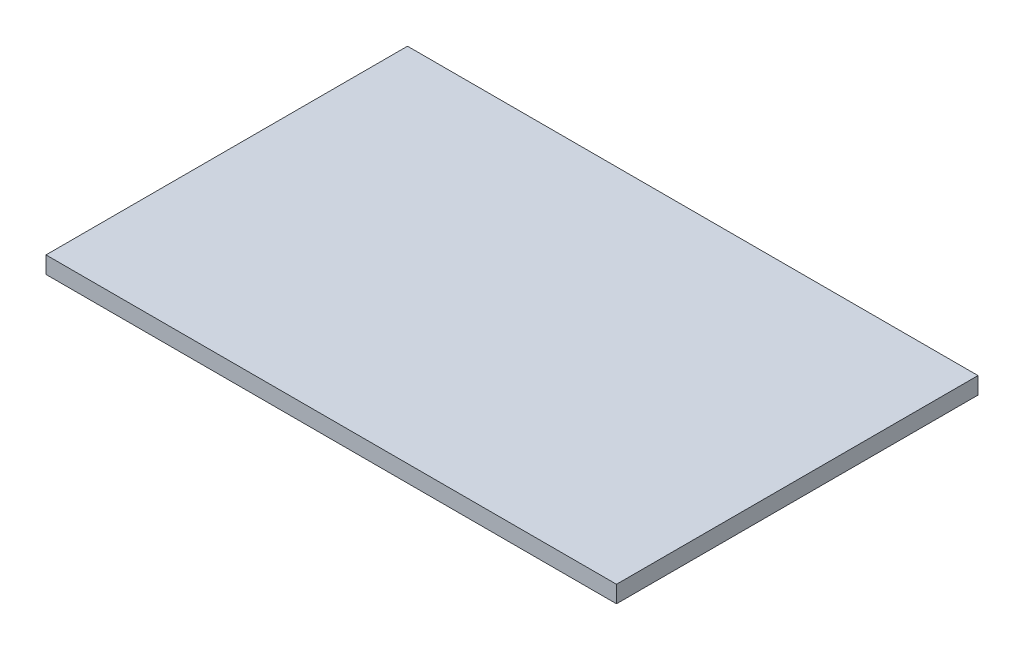
ISO-10303-21;
HEADER;
FILE_DESCRIPTION(('STEP AP214'),'2;1');
FILE_NAME('part.step','',(''),(''),'','','');
FILE_SCHEMA(('AUTOMOTIVE_DESIGN { 1 0 10303 214 1 1 1 1 }'));
ENDSEC;
DATA;
#1=APPLICATION_CONTEXT('core data for automotive mechanical design processes');
#2=APPLICATION_PROTOCOL_DEFINITION('international standard','automotive_design',2000,#1);
#3=PRODUCT_CONTEXT('',#1,'mechanical');
#4=PRODUCT('Part','Part','',(#3));
#5=PRODUCT_RELATED_PRODUCT_CATEGORY('part','',(#4));
#6=PRODUCT_DEFINITION_FORMATION('','',#4);
#7=PRODUCT_DEFINITION_CONTEXT('part definition',#1,'design');
#8=PRODUCT_DEFINITION('design','',#6,#7);
#9=PRODUCT_DEFINITION_SHAPE('','',#8);
#10=(LENGTH_UNIT() NAMED_UNIT(*) SI_UNIT(.MILLI.,.METRE.));
#11=(NAMED_UNIT(*) PLANE_ANGLE_UNIT() SI_UNIT($,.RADIAN.));
#12=(NAMED_UNIT(*) SI_UNIT($,.STERADIAN.) SOLID_ANGLE_UNIT());
#13=UNCERTAINTY_MEASURE_WITH_UNIT(LENGTH_MEASURE(1.E-05),#10,'distance_accuracy_value','');
#14=(GEOMETRIC_REPRESENTATION_CONTEXT(3) GLOBAL_UNCERTAINTY_ASSIGNED_CONTEXT((#13)) GLOBAL_UNIT_ASSIGNED_CONTEXT((#10,
#11,#12)) REPRESENTATION_CONTEXT('',''));
#15=CARTESIAN_POINT('',(0.,0.,0.));
#16=DIRECTION('',(0.,0.,1.));
#17=DIRECTION('',(1.,0.,0.));
#18=AXIS2_PLACEMENT_3D('',#15,#16,#17);
#19=CARTESIAN_POINT('',(50.5,3.,32.));
#20=DIRECTION('',(-1.,0.,0.));
#21=DIRECTION('',(0.,0.,1.));
#22=AXIS2_PLACEMENT_3D('',#19,#20,#21);
#23=PLANE('',#22);
#24=DIRECTION('',(0.,0.,-1.));
#25=VECTOR('',#24,1.);
#26=CARTESIAN_POINT('',(50.5,0.,32.));
#27=LINE('',#26,#25);
#28=CARTESIAN_POINT('',(50.5,0.,32.));
#29=VERTEX_POINT('',#28);
#30=CARTESIAN_POINT('',(50.5,0.,-32.));
#31=VERTEX_POINT('',#30);
#32=EDGE_CURVE('E96',#29,#31,#27,.T.);
#33=ORIENTED_EDGE('',*,*,#32,.T.);
#34=DIRECTION('',(0.,-1.,0.));
#35=VECTOR('',#34,1.);
#36=CARTESIAN_POINT('',(50.5,3.,-32.));
#37=LINE('',#36,#35);
#38=CARTESIAN_POINT('',(50.5,3.,-32.));
#39=VERTEX_POINT('',#38);
#40=EDGE_CURVE('E11',#39,#31,#37,.T.);
#41=ORIENTED_EDGE('',*,*,#40,.F.);
#42=DIRECTION('',(0.,0.,-1.));
#43=VECTOR('',#42,1.);
#44=CARTESIAN_POINT('',(50.5,3.,32.));
#45=LINE('',#44,#43);
#46=CARTESIAN_POINT('',(50.5,3.,32.));
#47=VERTEX_POINT('',#46);
#48=EDGE_CURVE('E84',#47,#39,#45,.T.);
#49=ORIENTED_EDGE('',*,*,#48,.F.);
#50=DIRECTION('',(0.,-1.,0.));
#51=VECTOR('',#50,1.);
#52=CARTESIAN_POINT('',(50.5,3.,32.));
#53=LINE('',#52,#51);
#54=EDGE_CURVE('E92',#47,#29,#53,.T.);
#55=ORIENTED_EDGE('',*,*,#54,.T.);
#56=EDGE_LOOP('',(#33,#41,#49,#55));
#57=FACE_BOUND('',#56,.T.);
#58=ADVANCED_FACE('F33',(#57),#23,.F.);
#59=CARTESIAN_POINT('',(-50.5,3.,-32.));
#60=DIRECTION('',(0.,0.,1.));
#61=DIRECTION('',(1.,0.,0.));
#62=AXIS2_PLACEMENT_3D('',#59,#60,#61);
#63=PLANE('',#62);
#64=DIRECTION('',(-1.,0.,0.));
#65=VECTOR('',#64,1.);
#66=CARTESIAN_POINT('',(-50.5,0.,-32.));
#67=LINE('',#66,#65);
#68=CARTESIAN_POINT('',(-50.5,0.,-32.));
#69=VERTEX_POINT('',#68);
#70=EDGE_CURVE('E88',#31,#69,#67,.T.);
#71=ORIENTED_EDGE('',*,*,#70,.T.);
#72=DIRECTION('',(0.,-1.,0.));
#73=VECTOR('',#72,1.);
#74=CARTESIAN_POINT('',(-50.5,3.,-32.));
#75=LINE('',#74,#73);
#76=CARTESIAN_POINT('',(-50.5,3.,-32.));
#77=VERTEX_POINT('',#76);
#78=EDGE_CURVE('E41',#77,#69,#75,.T.);
#79=ORIENTED_EDGE('',*,*,#78,.F.);
#80=DIRECTION('',(-1.,0.,0.));
#81=VECTOR('',#80,1.);
#82=CARTESIAN_POINT('',(-50.5,3.,-32.));
#83=LINE('',#82,#81);
#84=EDGE_CURVE('E79',#39,#77,#83,.T.);
#85=ORIENTED_EDGE('',*,*,#84,.F.);
#86=ORIENTED_EDGE('',*,*,#40,.T.);
#87=EDGE_LOOP('',(#71,#79,#85,#86));
#88=FACE_BOUND('',#87,.T.);
#89=ADVANCED_FACE('F87',(#88),#63,.F.);
#90=CARTESIAN_POINT('',(-50.5,3.,32.));
#91=DIRECTION('',(1.,0.,0.));
#92=DIRECTION('',(0.,0.,-1.));
#93=AXIS2_PLACEMENT_3D('',#90,#91,#92);
#94=PLANE('',#93);
#95=DIRECTION('',(0.,0.,1.));
#96=VECTOR('',#95,1.);
#97=CARTESIAN_POINT('',(-50.5,0.,32.));
#98=LINE('',#97,#96);
#99=CARTESIAN_POINT('',(-50.5,0.,32.));
#100=VERTEX_POINT('',#99);
#101=EDGE_CURVE('E66',#69,#100,#98,.T.);
#102=ORIENTED_EDGE('',*,*,#101,.T.);
#103=DIRECTION('',(0.,-1.,0.));
#104=VECTOR('',#103,1.);
#105=CARTESIAN_POINT('',(-50.5,3.,32.));
#106=LINE('',#105,#104);
#107=CARTESIAN_POINT('',(-50.5,3.,32.));
#108=VERTEX_POINT('',#107);
#109=EDGE_CURVE('E89',#108,#100,#106,.T.);
#110=ORIENTED_EDGE('',*,*,#109,.F.);
#111=DIRECTION('',(0.,0.,1.));
#112=VECTOR('',#111,1.);
#113=CARTESIAN_POINT('',(-50.5,3.,32.));
#114=LINE('',#113,#112);
#115=EDGE_CURVE('E82',#77,#108,#114,.T.);
#116=ORIENTED_EDGE('',*,*,#115,.F.);
#117=ORIENTED_EDGE('',*,*,#78,.T.);
#118=EDGE_LOOP('',(#102,#110,#116,#117));
#119=FACE_BOUND('',#118,.T.);
#120=ADVANCED_FACE('F90',(#119),#94,.F.);
#121=CARTESIAN_POINT('',(-50.5,3.,32.));
#122=DIRECTION('',(0.,0.,-1.));
#123=DIRECTION('',(-1.,0.,0.));
#124=AXIS2_PLACEMENT_3D('',#121,#122,#123);
#125=PLANE('',#124);
#126=DIRECTION('',(1.,0.,0.));
#127=VECTOR('',#126,1.);
#128=CARTESIAN_POINT('',(-50.5,0.,32.));
#129=LINE('',#128,#127);
#130=EDGE_CURVE('E72',#100,#29,#129,.T.);
#131=ORIENTED_EDGE('',*,*,#130,.T.);
#132=ORIENTED_EDGE('',*,*,#54,.F.);
#133=DIRECTION('',(1.,0.,0.));
#134=VECTOR('',#133,1.);
#135=CARTESIAN_POINT('',(-50.5,3.,32.));
#136=LINE('',#135,#134);
#137=EDGE_CURVE('E49',#108,#47,#136,.T.);
#138=ORIENTED_EDGE('',*,*,#137,.F.);
#139=ORIENTED_EDGE('',*,*,#109,.T.);
#140=EDGE_LOOP('',(#131,#132,#138,#139));
#141=FACE_BOUND('',#140,.T.);
#142=ADVANCED_FACE('F103',(#141),#125,.F.);
#143=CARTESIAN_POINT('',(0.,3.,0.));
#144=DIRECTION('',(0.,-1.,0.));
#145=DIRECTION('',(0.,0.,-1.));
#146=AXIS2_PLACEMENT_3D('',#143,#144,#145);
#147=PLANE('',#146);
#148=ORIENTED_EDGE('',*,*,#48,.T.);
#149=ORIENTED_EDGE('',*,*,#84,.T.);
#150=ORIENTED_EDGE('',*,*,#115,.T.);
#151=ORIENTED_EDGE('',*,*,#137,.T.);
#152=EDGE_LOOP('',(#148,#149,#150,#151));
#153=FACE_BOUND('',#152,.T.);
#154=ADVANCED_FACE('F80',(#153),#147,.F.);
#155=CARTESIAN_POINT('',(0.,0.,0.));
#156=DIRECTION('',(0.,-1.,0.));
#157=DIRECTION('',(0.,0.,-1.));
#158=AXIS2_PLACEMENT_3D('',#155,#156,#157);
#159=PLANE('',#158);
#160=ORIENTED_EDGE('',*,*,#32,.F.);
#161=ORIENTED_EDGE('',*,*,#130,.F.);
#162=ORIENTED_EDGE('',*,*,#101,.F.);
#163=ORIENTED_EDGE('',*,*,#70,.F.);
#164=EDGE_LOOP('',(#160,#161,#162,#163));
#165=FACE_BOUND('',#164,.T.);
#166=ADVANCED_FACE('F106',(#165),#159,.T.);
#167=CLOSED_SHELL('',(#58,#89,#120,#142,#154,#166));
#168=MANIFOLD_SOLID_BREP('B2',#167);
#169=ADVANCED_BREP_SHAPE_REPRESENTATION('',(#18,#168),#14);
#170=SHAPE_DEFINITION_REPRESENTATION(#9,#169);
ENDSEC;
END-ISO-10303-21;
